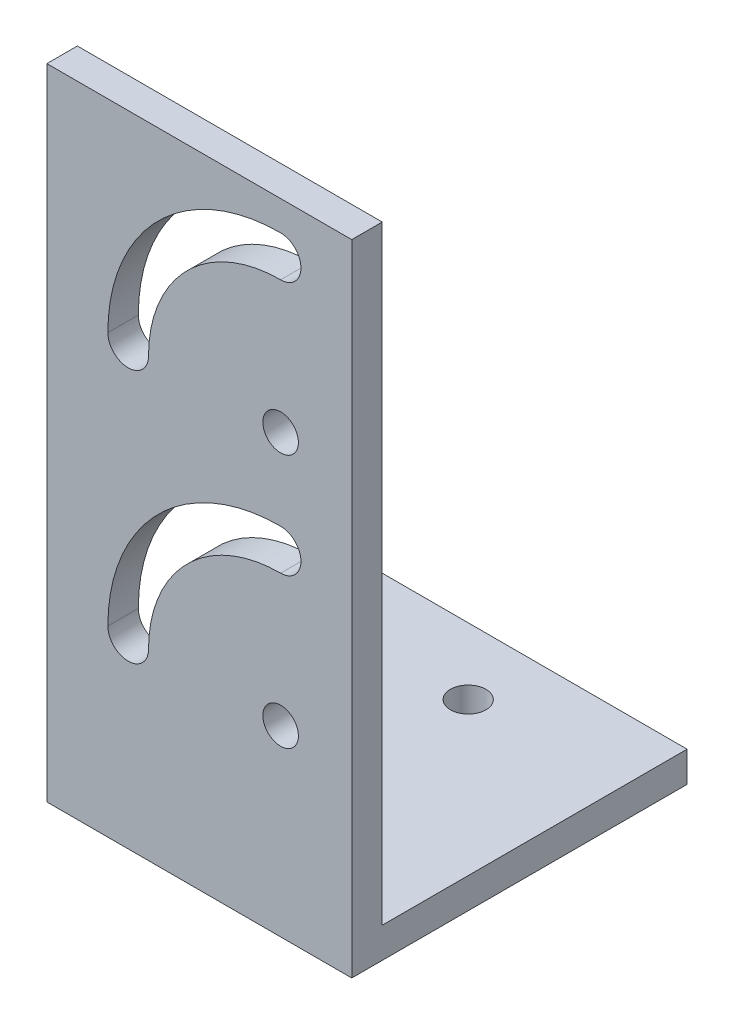
ISO-10303-21;
HEADER;
FILE_DESCRIPTION(('STEP AP214'),'2;1');
FILE_NAME('part.step','',(''),(''),'','','');
FILE_SCHEMA(('AUTOMOTIVE_DESIGN { 1 0 10303 214 1 1 1 1 }'));
ENDSEC;
DATA;
#1=APPLICATION_CONTEXT('core data for automotive mechanical design processes');
#2=APPLICATION_PROTOCOL_DEFINITION('international standard','automotive_design',2000,#1);
#3=PRODUCT_CONTEXT('',#1,'mechanical');
#4=PRODUCT('Part','Part','',(#3));
#5=PRODUCT_RELATED_PRODUCT_CATEGORY('part','',(#4));
#6=PRODUCT_DEFINITION_FORMATION('','',#4);
#7=PRODUCT_DEFINITION_CONTEXT('part definition',#1,'design');
#8=PRODUCT_DEFINITION('design','',#6,#7);
#9=PRODUCT_DEFINITION_SHAPE('','',#8);
#10=(LENGTH_UNIT() NAMED_UNIT(*) SI_UNIT(.MILLI.,.METRE.));
#11=(NAMED_UNIT(*) PLANE_ANGLE_UNIT() SI_UNIT($,.RADIAN.));
#12=(NAMED_UNIT(*) SI_UNIT($,.STERADIAN.) SOLID_ANGLE_UNIT());
#13=UNCERTAINTY_MEASURE_WITH_UNIT(LENGTH_MEASURE(1.E-05),#10,'distance_accuracy_value','');
#14=(GEOMETRIC_REPRESENTATION_CONTEXT(3) GLOBAL_UNCERTAINTY_ASSIGNED_CONTEXT((#13)) GLOBAL_UNIT_ASSIGNED_CONTEXT((#10,
#11,#12)) REPRESENTATION_CONTEXT('',''));
#15=CARTESIAN_POINT('',(0.,0.,0.));
#16=DIRECTION('',(0.,0.,1.));
#17=DIRECTION('',(1.,0.,0.));
#18=AXIS2_PLACEMENT_3D('',#15,#16,#17);
#19=CARTESIAN_POINT('',(15.,3.,15.));
#20=DIRECTION('',(-1.,0.,0.));
#21=DIRECTION('',(0.,0.,1.));
#22=AXIS2_PLACEMENT_3D('',#19,#20,#21);
#23=PLANE('',#22);
#24=DIRECTION('',(0.,0.,-1.));
#25=VECTOR('',#24,1.);
#26=CARTESIAN_POINT('',(15.,0.,15.));
#27=LINE('',#26,#25);
#28=CARTESIAN_POINT('',(15.,0.,18.));
#29=VERTEX_POINT('',#28);
#30=CARTESIAN_POINT('',(15.,0.,-15.));
#31=VERTEX_POINT('',#30);
#32=EDGE_CURVE('E244',#29,#31,#27,.T.);
#33=ORIENTED_EDGE('',*,*,#32,.T.);
#34=DIRECTION('',(0.,-1.,0.));
#35=VECTOR('',#34,1.);
#36=CARTESIAN_POINT('',(15.,3.,-15.));
#37=LINE('',#36,#35);
#38=CARTESIAN_POINT('',(15.,3.,-15.));
#39=VERTEX_POINT('',#38);
#40=EDGE_CURVE('E11',#39,#31,#37,.T.);
#41=ORIENTED_EDGE('',*,*,#40,.F.);
#42=DIRECTION('',(0.,0.,-1.));
#43=VECTOR('',#42,1.);
#44=CARTESIAN_POINT('',(15.,3.,15.));
#45=LINE('',#44,#43);
#46=CARTESIAN_POINT('',(15.,3.,15.));
#47=VERTEX_POINT('',#46);
#48=EDGE_CURVE('E253',#47,#39,#45,.T.);
#49=ORIENTED_EDGE('',*,*,#48,.F.);
#50=DIRECTION('',(0.,1.,0.));
#51=VECTOR('',#50,1.);
#52=CARTESIAN_POINT('',(15.,0.,15.));
#53=LINE('',#52,#51);
#54=CARTESIAN_POINT('',(15.,62.9241904633983,15.));
#55=VERTEX_POINT('',#54);
#56=EDGE_CURVE('E232',#47,#55,#53,.T.);
#57=ORIENTED_EDGE('',*,*,#56,.T.);
#58=DIRECTION('',(0.,0.,-1.));
#59=VECTOR('',#58,1.);
#60=CARTESIAN_POINT('',(15.,62.9241904633983,18.));
#61=LINE('',#60,#59);
#62=CARTESIAN_POINT('',(15.,62.9241904633983,18.));
#63=VERTEX_POINT('',#62);
#64=EDGE_CURVE('E237',#63,#55,#61,.T.);
#65=ORIENTED_EDGE('',*,*,#64,.F.);
#66=DIRECTION('',(0.,1.,0.));
#67=VECTOR('',#66,1.);
#68=CARTESIAN_POINT('',(15.,0.,18.));
#69=LINE('',#68,#67);
#70=EDGE_CURVE('E225',#29,#63,#69,.T.);
#71=ORIENTED_EDGE('',*,*,#70,.F.);
#72=EDGE_LOOP('',(#33,#41,#49,#57,#65,#71));
#73=FACE_BOUND('',#72,.T.);
#74=ADVANCED_FACE('F35',(#73),#23,.F.);
#75=CARTESIAN_POINT('',(-15.,3.,-15.));
#76=DIRECTION('',(0.,0.,1.));
#77=DIRECTION('',(1.,0.,0.));
#78=AXIS2_PLACEMENT_3D('',#75,#76,#77);
#79=PLANE('',#78);
#80=DIRECTION('',(-1.,0.,0.));
#81=VECTOR('',#80,1.);
#82=CARTESIAN_POINT('',(-15.,0.,-15.));
#83=LINE('',#82,#81);
#84=CARTESIAN_POINT('',(-15.,0.,-15.));
#85=VERTEX_POINT('',#84);
#86=EDGE_CURVE('E267',#31,#85,#83,.T.);
#87=ORIENTED_EDGE('',*,*,#86,.T.);
#88=DIRECTION('',(0.,-1.,0.));
#89=VECTOR('',#88,1.);
#90=CARTESIAN_POINT('',(-15.,3.,-15.));
#91=LINE('',#90,#89);
#92=CARTESIAN_POINT('',(-15.,3.,-15.));
#93=VERTEX_POINT('',#92);
#94=EDGE_CURVE('E42',#93,#85,#91,.T.);
#95=ORIENTED_EDGE('',*,*,#94,.F.);
#96=DIRECTION('',(-1.,0.,0.));
#97=VECTOR('',#96,1.);
#98=CARTESIAN_POINT('',(-15.,3.,-15.));
#99=LINE('',#98,#97);
#100=EDGE_CURVE('E256',#39,#93,#99,.T.);
#101=ORIENTED_EDGE('',*,*,#100,.F.);
#102=ORIENTED_EDGE('',*,*,#40,.T.);
#103=EDGE_LOOP('',(#87,#95,#101,#102));
#104=FACE_BOUND('',#103,.T.);
#105=ADVANCED_FACE('F295',(#104),#79,.F.);
#106=CARTESIAN_POINT('',(-15.,3.,15.));
#107=DIRECTION('',(1.,0.,0.));
#108=DIRECTION('',(0.,0.,-1.));
#109=AXIS2_PLACEMENT_3D('',#106,#107,#108);
#110=PLANE('',#109);
#111=DIRECTION('',(0.,0.,1.));
#112=VECTOR('',#111,1.);
#113=CARTESIAN_POINT('',(-15.,0.,15.));
#114=LINE('',#113,#112);
#115=CARTESIAN_POINT('',(-15.,0.,18.));
#116=VERTEX_POINT('',#115);
#117=EDGE_CURVE('E257',#85,#116,#114,.T.);
#118=ORIENTED_EDGE('',*,*,#117,.T.);
#119=DIRECTION('',(0.,-1.,0.));
#120=VECTOR('',#119,1.);
#121=CARTESIAN_POINT('',(-15.,0.,18.));
#122=LINE('',#121,#120);
#123=CARTESIAN_POINT('',(-15.,62.9241904633983,18.));
#124=VERTEX_POINT('',#123);
#125=EDGE_CURVE('E218',#124,#116,#122,.T.);
#126=ORIENTED_EDGE('',*,*,#125,.F.);
#127=DIRECTION('',(0.,0.,-1.));
#128=VECTOR('',#127,1.);
#129=CARTESIAN_POINT('',(-15.,62.9241904633983,18.));
#130=LINE('',#129,#128);
#131=CARTESIAN_POINT('',(-15.,62.9241904633983,15.));
#132=VERTEX_POINT('',#131);
#133=EDGE_CURVE('E229',#124,#132,#130,.T.);
#134=ORIENTED_EDGE('',*,*,#133,.T.);
#135=DIRECTION('',(0.,-1.,0.));
#136=VECTOR('',#135,1.);
#137=CARTESIAN_POINT('',(-15.,0.,15.));
#138=LINE('',#137,#136);
#139=CARTESIAN_POINT('',(-15.,3.,15.));
#140=VERTEX_POINT('',#139);
#141=EDGE_CURVE('E215',#132,#140,#138,.T.);
#142=ORIENTED_EDGE('',*,*,#141,.T.);
#143=DIRECTION('',(0.,0.,1.));
#144=VECTOR('',#143,1.);
#145=CARTESIAN_POINT('',(-15.,3.,15.));
#146=LINE('',#145,#144);
#147=EDGE_CURVE('E259',#93,#140,#146,.T.);
#148=ORIENTED_EDGE('',*,*,#147,.F.);
#149=ORIENTED_EDGE('',*,*,#94,.T.);
#150=EDGE_LOOP('',(#118,#126,#134,#142,#148,#149));
#151=FACE_BOUND('',#150,.T.);
#152=ADVANCED_FACE('F274',(#151),#110,.F.);
#153=CARTESIAN_POINT('',(0.,3.,0.));
#154=DIRECTION('',(0.,-1.,0.));
#155=DIRECTION('',(0.,0.,-1.));
#156=AXIS2_PLACEMENT_3D('',#153,#154,#155);
#157=PLANE('',#156);
#158=CARTESIAN_POINT('',(0.,3.,6.54268355275151));
#159=DIRECTION('',(0.,1.,0.));
#160=DIRECTION('',(0.,0.,1.));
#161=AXIS2_PLACEMENT_3D('',#158,#159,#160);
#162=CIRCLE('',#161,1.75);
#163=CARTESIAN_POINT('',(0.,3.,8.29268355275151));
#164=VERTEX_POINT('',#163);
#165=EDGE_CURVE('E245',#164,#164,#162,.T.);
#166=ORIENTED_EDGE('',*,*,#165,.F.);
#167=EDGE_LOOP('',(#166));
#168=FACE_BOUND('',#167,.T.);
#169=CARTESIAN_POINT('',(0.,3.,-8.45731644724849));
#170=DIRECTION('',(0.,1.,0.));
#171=DIRECTION('',(0.,0.,1.));
#172=AXIS2_PLACEMENT_3D('',#169,#170,#171);
#173=CIRCLE('',#172,1.75);
#174=CARTESIAN_POINT('',(0.,3.,-6.70731644724849));
#175=VERTEX_POINT('',#174);
#176=EDGE_CURVE('E240',#175,#175,#173,.T.);
#177=ORIENTED_EDGE('',*,*,#176,.F.);
#178=EDGE_LOOP('',(#177));
#179=FACE_BOUND('',#178,.T.);
#180=ORIENTED_EDGE('',*,*,#48,.T.);
#181=ORIENTED_EDGE('',*,*,#100,.T.);
#182=ORIENTED_EDGE('',*,*,#147,.T.);
#183=DIRECTION('',(1.,0.,0.));
#184=VECTOR('',#183,1.);
#185=CARTESIAN_POINT('',(-15.,3.,15.));
#186=LINE('',#185,#184);
#187=EDGE_CURVE('E262',#140,#47,#186,.T.);
#188=ORIENTED_EDGE('',*,*,#187,.T.);
#189=EDGE_LOOP('',(#180,#181,#182,#188));
#190=FACE_BOUND('',#189,.T.);
#191=ADVANCED_FACE('F291',(#168,#179,#190),#157,.F.);
#192=CARTESIAN_POINT('',(0.,0.,0.));
#193=DIRECTION('',(0.,-1.,0.));
#194=DIRECTION('',(0.,0.,-1.));
#195=AXIS2_PLACEMENT_3D('',#192,#193,#194);
#196=PLANE('',#195);
#197=CARTESIAN_POINT('',(0.,0.,6.54268355275151));
#198=DIRECTION('',(0.,1.,0.));
#199=DIRECTION('',(0.,0.,1.));
#200=AXIS2_PLACEMENT_3D('',#197,#198,#199);
#201=CIRCLE('',#200,1.75);
#202=CARTESIAN_POINT('',(0.,0.,8.29268355275151));
#203=VERTEX_POINT('',#202);
#204=EDGE_CURVE('E241',#203,#203,#201,.T.);
#205=ORIENTED_EDGE('',*,*,#204,.T.);
#206=EDGE_LOOP('',(#205));
#207=FACE_BOUND('',#206,.T.);
#208=CARTESIAN_POINT('',(0.,0.,-8.45731644724849));
#209=DIRECTION('',(0.,1.,0.));
#210=DIRECTION('',(0.,0.,1.));
#211=AXIS2_PLACEMENT_3D('',#208,#209,#210);
#212=CIRCLE('',#211,1.75);
#213=CARTESIAN_POINT('',(0.,0.,-6.70731644724849));
#214=VERTEX_POINT('',#213);
#215=EDGE_CURVE('E248',#214,#214,#212,.T.);
#216=ORIENTED_EDGE('',*,*,#215,.T.);
#217=EDGE_LOOP('',(#216));
#218=FACE_BOUND('',#217,.T.);
#219=ORIENTED_EDGE('',*,*,#32,.F.);
#220=DIRECTION('',(1.,0.,0.));
#221=VECTOR('',#220,1.);
#222=CARTESIAN_POINT('',(-15.,0.,18.));
#223=LINE('',#222,#221);
#224=EDGE_CURVE('E221',#116,#29,#223,.T.);
#225=ORIENTED_EDGE('',*,*,#224,.F.);
#226=ORIENTED_EDGE('',*,*,#117,.F.);
#227=ORIENTED_EDGE('',*,*,#86,.F.);
#228=EDGE_LOOP('',(#219,#225,#226,#227));
#229=FACE_BOUND('',#228,.T.);
#230=ADVANCED_FACE('F279',(#207,#218,#229),#196,.T.);
#231=CARTESIAN_POINT('',(0.,0.,-8.45731644724849));
#232=DIRECTION('',(0.,1.,0.));
#233=DIRECTION('',(0.,0.,1.));
#234=AXIS2_PLACEMENT_3D('',#231,#232,#233);
#235=CYLINDRICAL_SURFACE('',#234,1.75);
#236=ORIENTED_EDGE('',*,*,#215,.F.);
#237=EDGE_LOOP('',(#236));
#238=FACE_BOUND('',#237,.T.);
#239=ORIENTED_EDGE('',*,*,#176,.T.);
#240=EDGE_LOOP('',(#239));
#241=FACE_BOUND('',#240,.T.);
#242=ADVANCED_FACE('F305',(#238,#241),#235,.F.);
#243=CARTESIAN_POINT('',(0.,0.,6.54268355275151));
#244=DIRECTION('',(0.,1.,0.));
#245=DIRECTION('',(0.,0.,1.));
#246=AXIS2_PLACEMENT_3D('',#243,#244,#245);
#247=CYLINDRICAL_SURFACE('',#246,1.75);
#248=ORIENTED_EDGE('',*,*,#204,.F.);
#249=EDGE_LOOP('',(#248));
#250=FACE_BOUND('',#249,.T.);
#251=ORIENTED_EDGE('',*,*,#165,.T.);
#252=EDGE_LOOP('',(#251));
#253=FACE_BOUND('',#252,.T.);
#254=ADVANCED_FACE('F312',(#250,#253),#247,.F.);
#255=CARTESIAN_POINT('',(0.,0.,15.));
#256=DIRECTION('',(0.,0.,-1.));
#257=DIRECTION('',(-1.,0.,0.));
#258=AXIS2_PLACEMENT_3D('',#255,#256,#257);
#259=PLANE('',#258);
#260=CARTESIAN_POINT('',(8.,43.,15.));
#261=DIRECTION('',(0.,0.,1.));
#262=DIRECTION('',(-1.,0.,0.));
#263=AXIS2_PLACEMENT_3D('',#260,#261,#262);
#264=CIRCLE('',#263,17.);
#265=CARTESIAN_POINT('',(8.00000000000001,60.,15.));
#266=VERTEX_POINT('',#265);
#267=CARTESIAN_POINT('',(-8.99999999999999,43.,15.));
#268=VERTEX_POINT('',#267);
#269=EDGE_CURVE('E176',#266,#268,#264,.T.);
#270=ORIENTED_EDGE('',*,*,#269,.T.);
#271=CARTESIAN_POINT('',(-6.99999999999999,43.,15.));
#272=DIRECTION('',(0.,0.,1.));
#273=DIRECTION('',(-1.,0.,0.));
#274=AXIS2_PLACEMENT_3D('',#271,#272,#273);
#275=CIRCLE('',#274,2.);
#276=CARTESIAN_POINT('',(-4.99999999999999,43.,15.));
#277=VERTEX_POINT('',#276);
#278=EDGE_CURVE('E179',#268,#277,#275,.T.);
#279=ORIENTED_EDGE('',*,*,#278,.T.);
#280=CARTESIAN_POINT('',(8.,43.,15.));
#281=DIRECTION('',(0.,0.,-1.));
#282=DIRECTION('',(-1.,0.,0.));
#283=AXIS2_PLACEMENT_3D('',#280,#281,#282);
#284=CIRCLE('',#283,13.);
#285=CARTESIAN_POINT('',(8.00000000000001,56.,15.));
#286=VERTEX_POINT('',#285);
#287=EDGE_CURVE('E49',#277,#286,#284,.T.);
#288=ORIENTED_EDGE('',*,*,#287,.T.);
#289=CARTESIAN_POINT('',(8.00000000000001,58.,15.));
#290=DIRECTION('',(0.,0.,1.));
#291=DIRECTION('',(-1.,0.,0.));
#292=AXIS2_PLACEMENT_3D('',#289,#290,#291);
#293=CIRCLE('',#292,2.);
#294=EDGE_CURVE('E184',#286,#266,#293,.T.);
#295=ORIENTED_EDGE('',*,*,#294,.T.);
#296=EDGE_LOOP('',(#270,#279,#288,#295));
#297=FACE_BOUND('',#296,.T.);
#298=CARTESIAN_POINT('',(8.,18.,15.));
#299=DIRECTION('',(0.,0.,1.));
#300=DIRECTION('',(-1.,0.,0.));
#301=AXIS2_PLACEMENT_3D('',#298,#299,#300);
#302=CIRCLE('',#301,1.75);
#303=CARTESIAN_POINT('',(6.25,18.,15.));
#304=VERTEX_POINT('',#303);
#305=EDGE_CURVE('E191',#304,#304,#302,.T.);
#306=ORIENTED_EDGE('',*,*,#305,.T.);
#307=EDGE_LOOP('',(#306));
#308=FACE_BOUND('',#307,.T.);
#309=CARTESIAN_POINT('',(8.,18.,15.));
#310=DIRECTION('',(0.,0.,-1.));
#311=DIRECTION('',(-1.,0.,0.));
#312=AXIS2_PLACEMENT_3D('',#309,#310,#311);
#313=CIRCLE('',#312,13.);
#314=CARTESIAN_POINT('',(-5.,18.,15.));
#315=VERTEX_POINT('',#314);
#316=CARTESIAN_POINT('',(8.,31.,15.));
#317=VERTEX_POINT('',#316);
#318=EDGE_CURVE('E139',#315,#317,#313,.T.);
#319=ORIENTED_EDGE('',*,*,#318,.T.);
#320=CARTESIAN_POINT('',(8.,33.,15.));
#321=DIRECTION('',(0.,0.,1.));
#322=DIRECTION('',(-1.,0.,0.));
#323=AXIS2_PLACEMENT_3D('',#320,#321,#322);
#324=CIRCLE('',#323,2.);
#325=CARTESIAN_POINT('',(8.,35.,15.));
#326=VERTEX_POINT('',#325);
#327=EDGE_CURVE('E150',#317,#326,#324,.T.);
#328=ORIENTED_EDGE('',*,*,#327,.T.);
#329=CARTESIAN_POINT('',(8.,18.,15.));
#330=DIRECTION('',(0.,0.,1.));
#331=DIRECTION('',(-1.,0.,0.));
#332=AXIS2_PLACEMENT_3D('',#329,#330,#331);
#333=CIRCLE('',#332,17.);
#334=CARTESIAN_POINT('',(-9.,18.,15.));
#335=VERTEX_POINT('',#334);
#336=EDGE_CURVE('E57',#326,#335,#333,.T.);
#337=ORIENTED_EDGE('',*,*,#336,.T.);
#338=CARTESIAN_POINT('',(-7.,18.,15.));
#339=DIRECTION('',(0.,0.,1.));
#340=DIRECTION('',(-1.,0.,0.));
#341=AXIS2_PLACEMENT_3D('',#338,#339,#340);
#342=CIRCLE('',#341,2.);
#343=EDGE_CURVE('E147',#335,#315,#342,.T.);
#344=ORIENTED_EDGE('',*,*,#343,.T.);
#345=EDGE_LOOP('',(#319,#328,#337,#344));
#346=FACE_BOUND('',#345,.T.);
#347=CARTESIAN_POINT('',(8.,43.,15.));
#348=DIRECTION('',(0.,0.,1.));
#349=DIRECTION('',(-1.,0.,0.));
#350=AXIS2_PLACEMENT_3D('',#347,#348,#349);
#351=CIRCLE('',#350,1.75);
#352=CARTESIAN_POINT('',(6.25,43.,15.));
#353=VERTEX_POINT('',#352);
#354=EDGE_CURVE('E212',#353,#353,#351,.T.);
#355=ORIENTED_EDGE('',*,*,#354,.T.);
#356=EDGE_LOOP('',(#355));
#357=FACE_BOUND('',#356,.T.);
#358=ORIENTED_EDGE('',*,*,#187,.F.);
#359=ORIENTED_EDGE('',*,*,#141,.F.);
#360=DIRECTION('',(-1.,0.,0.));
#361=VECTOR('',#360,1.);
#362=CARTESIAN_POINT('',(-15.,62.9241904633983,15.));
#363=LINE('',#362,#361);
#364=EDGE_CURVE('E222',#55,#132,#363,.T.);
#365=ORIENTED_EDGE('',*,*,#364,.F.);
#366=ORIENTED_EDGE('',*,*,#56,.F.);
#367=EDGE_LOOP('',(#358,#359,#365,#366));
#368=FACE_BOUND('',#367,.T.);
#369=ADVANCED_FACE('F154',(#297,#308,#346,#357,#368),#259,.T.);
#370=CARTESIAN_POINT('',(-15.,62.9241904633983,18.));
#371=DIRECTION('',(0.,-1.,0.));
#372=DIRECTION('',(0.,0.,-1.));
#373=AXIS2_PLACEMENT_3D('',#370,#371,#372);
#374=PLANE('',#373);
#375=ORIENTED_EDGE('',*,*,#364,.T.);
#376=ORIENTED_EDGE('',*,*,#133,.F.);
#377=DIRECTION('',(-1.,0.,0.));
#378=VECTOR('',#377,1.);
#379=CARTESIAN_POINT('',(-15.,62.9241904633983,18.));
#380=LINE('',#379,#378);
#381=EDGE_CURVE('E227',#63,#124,#380,.T.);
#382=ORIENTED_EDGE('',*,*,#381,.F.);
#383=ORIENTED_EDGE('',*,*,#64,.T.);
#384=EDGE_LOOP('',(#375,#376,#382,#383));
#385=FACE_BOUND('',#384,.T.);
#386=ADVANCED_FACE('F317',(#385),#374,.F.);
#387=CARTESIAN_POINT('',(0.,0.,18.));
#388=DIRECTION('',(0.,0.,-1.));
#389=DIRECTION('',(-1.,0.,0.));
#390=AXIS2_PLACEMENT_3D('',#387,#388,#389);
#391=PLANE('',#390);
#392=CARTESIAN_POINT('',(-6.99999999999999,43.,18.));
#393=DIRECTION('',(0.,0.,1.));
#394=DIRECTION('',(-1.,0.,0.));
#395=AXIS2_PLACEMENT_3D('',#392,#393,#394);
#396=CIRCLE('',#395,2.);
#397=CARTESIAN_POINT('',(-8.99999999999999,43.,18.));
#398=VERTEX_POINT('',#397);
#399=CARTESIAN_POINT('',(-4.99999999999999,43.,18.));
#400=VERTEX_POINT('',#399);
#401=EDGE_CURVE('E190',#398,#400,#396,.T.);
#402=ORIENTED_EDGE('',*,*,#401,.F.);
#403=CARTESIAN_POINT('',(8.,43.,18.));
#404=DIRECTION('',(0.,0.,1.));
#405=DIRECTION('',(-1.,0.,0.));
#406=AXIS2_PLACEMENT_3D('',#403,#404,#405);
#407=CIRCLE('',#406,17.);
#408=CARTESIAN_POINT('',(8.00000000000001,60.,18.));
#409=VERTEX_POINT('',#408);
#410=EDGE_CURVE('E188',#409,#398,#407,.T.);
#411=ORIENTED_EDGE('',*,*,#410,.F.);
#412=CARTESIAN_POINT('',(8.00000000000001,58.,18.));
#413=DIRECTION('',(0.,0.,1.));
#414=DIRECTION('',(-1.,0.,0.));
#415=AXIS2_PLACEMENT_3D('',#412,#413,#414);
#416=CIRCLE('',#415,2.);
#417=CARTESIAN_POINT('',(8.00000000000001,56.,18.));
#418=VERTEX_POINT('',#417);
#419=EDGE_CURVE('E180',#418,#409,#416,.T.);
#420=ORIENTED_EDGE('',*,*,#419,.F.);
#421=CARTESIAN_POINT('',(8.,43.,18.));
#422=DIRECTION('',(0.,0.,-1.));
#423=DIRECTION('',(-1.,0.,0.));
#424=AXIS2_PLACEMENT_3D('',#421,#422,#423);
#425=CIRCLE('',#424,13.);
#426=EDGE_CURVE('E194',#400,#418,#425,.T.);
#427=ORIENTED_EDGE('',*,*,#426,.F.);
#428=EDGE_LOOP('',(#402,#411,#420,#427));
#429=FACE_BOUND('',#428,.T.);
#430=CARTESIAN_POINT('',(8.,18.,18.));
#431=DIRECTION('',(0.,0.,1.));
#432=DIRECTION('',(-1.,0.,0.));
#433=AXIS2_PLACEMENT_3D('',#430,#431,#432);
#434=CIRCLE('',#433,1.75);
#435=CARTESIAN_POINT('',(6.25,18.,18.));
#436=VERTEX_POINT('',#435);
#437=EDGE_CURVE('E172',#436,#436,#434,.T.);
#438=ORIENTED_EDGE('',*,*,#437,.F.);
#439=EDGE_LOOP('',(#438));
#440=FACE_BOUND('',#439,.T.);
#441=CARTESIAN_POINT('',(8.,33.,18.));
#442=DIRECTION('',(0.,0.,1.));
#443=DIRECTION('',(-1.,0.,0.));
#444=AXIS2_PLACEMENT_3D('',#441,#442,#443);
#445=CIRCLE('',#444,2.);
#446=CARTESIAN_POINT('',(8.,31.,18.));
#447=VERTEX_POINT('',#446);
#448=CARTESIAN_POINT('',(8.,35.,18.));
#449=VERTEX_POINT('',#448);
#450=EDGE_CURVE('E166',#447,#449,#445,.T.);
#451=ORIENTED_EDGE('',*,*,#450,.F.);
#452=CARTESIAN_POINT('',(8.,18.,18.));
#453=DIRECTION('',(0.,0.,-1.));
#454=DIRECTION('',(-1.,0.,0.));
#455=AXIS2_PLACEMENT_3D('',#452,#453,#454);
#456=CIRCLE('',#455,13.);
#457=CARTESIAN_POINT('',(-5.,18.,18.));
#458=VERTEX_POINT('',#457);
#459=EDGE_CURVE('E142',#458,#447,#456,.T.);
#460=ORIENTED_EDGE('',*,*,#459,.F.);
#461=CARTESIAN_POINT('',(-7.,18.,18.));
#462=DIRECTION('',(0.,0.,1.));
#463=DIRECTION('',(-1.,0.,0.));
#464=AXIS2_PLACEMENT_3D('',#461,#462,#463);
#465=CIRCLE('',#464,2.);
#466=CARTESIAN_POINT('',(-9.,18.,18.));
#467=VERTEX_POINT('',#466);
#468=EDGE_CURVE('E157',#467,#458,#465,.T.);
#469=ORIENTED_EDGE('',*,*,#468,.F.);
#470=CARTESIAN_POINT('',(8.,18.,18.));
#471=DIRECTION('',(0.,0.,1.));
#472=DIRECTION('',(-1.,0.,0.));
#473=AXIS2_PLACEMENT_3D('',#470,#471,#472);
#474=CIRCLE('',#473,17.);
#475=EDGE_CURVE('E160',#449,#467,#474,.T.);
#476=ORIENTED_EDGE('',*,*,#475,.F.);
#477=EDGE_LOOP('',(#451,#460,#469,#476));
#478=FACE_BOUND('',#477,.T.);
#479=CARTESIAN_POINT('',(8.,43.,18.));
#480=DIRECTION('',(0.,0.,1.));
#481=DIRECTION('',(-1.,0.,0.));
#482=AXIS2_PLACEMENT_3D('',#479,#480,#481);
#483=CIRCLE('',#482,1.75);
#484=CARTESIAN_POINT('',(6.25,43.,18.));
#485=VERTEX_POINT('',#484);
#486=EDGE_CURVE('E201',#485,#485,#483,.T.);
#487=ORIENTED_EDGE('',*,*,#486,.F.);
#488=EDGE_LOOP('',(#487));
#489=FACE_BOUND('',#488,.T.);
#490=ORIENTED_EDGE('',*,*,#125,.T.);
#491=ORIENTED_EDGE('',*,*,#224,.T.);
#492=ORIENTED_EDGE('',*,*,#70,.T.);
#493=ORIENTED_EDGE('',*,*,#381,.T.);
#494=EDGE_LOOP('',(#490,#491,#492,#493));
#495=FACE_BOUND('',#494,.T.);
#496=ADVANCED_FACE('F282',(#429,#440,#478,#489,#495),#391,.F.);
#497=CARTESIAN_POINT('',(8.,43.,15.));
#498=DIRECTION('',(0.,0.,1.));
#499=DIRECTION('',(1.,0.,0.));
#500=AXIS2_PLACEMENT_3D('',#497,#498,#499);
#501=CYLINDRICAL_SURFACE('',#500,1.75);
#502=ORIENTED_EDGE('',*,*,#354,.F.);
#503=EDGE_LOOP('',(#502));
#504=FACE_BOUND('',#503,.T.);
#505=ORIENTED_EDGE('',*,*,#486,.T.);
#506=EDGE_LOOP('',(#505));
#507=FACE_BOUND('',#506,.T.);
#508=ADVANCED_FACE('F325',(#504,#507),#501,.F.);
#509=CARTESIAN_POINT('',(8.,18.,15.));
#510=DIRECTION('',(0.,0.,1.));
#511=DIRECTION('',(1.,0.,0.));
#512=AXIS2_PLACEMENT_3D('',#509,#510,#511);
#513=CYLINDRICAL_SURFACE('',#512,13.);
#514=ORIENTED_EDGE('',*,*,#459,.T.);
#515=DIRECTION('',(0.,0.,1.));
#516=VECTOR('',#515,1.);
#517=CARTESIAN_POINT('',(8.,31.,15.));
#518=LINE('',#517,#516);
#519=EDGE_CURVE('E135',#317,#447,#518,.T.);
#520=ORIENTED_EDGE('',*,*,#519,.F.);
#521=ORIENTED_EDGE('',*,*,#318,.F.);
#522=DIRECTION('',(0.,0.,1.));
#523=VECTOR('',#522,1.);
#524=CARTESIAN_POINT('',(-5.,18.,15.));
#525=LINE('',#524,#523);
#526=EDGE_CURVE('E170',#315,#458,#525,.T.);
#527=ORIENTED_EDGE('',*,*,#526,.T.);
#528=EDGE_LOOP('',(#514,#520,#521,#527));
#529=FACE_BOUND('',#528,.T.);
#530=ADVANCED_FACE('F137',(#529),#513,.T.);
#531=CARTESIAN_POINT('',(-7.,18.,15.));
#532=DIRECTION('',(0.,0.,1.));
#533=DIRECTION('',(1.,0.,0.));
#534=AXIS2_PLACEMENT_3D('',#531,#532,#533);
#535=CYLINDRICAL_SURFACE('',#534,2.);
#536=ORIENTED_EDGE('',*,*,#468,.T.);
#537=ORIENTED_EDGE('',*,*,#526,.F.);
#538=ORIENTED_EDGE('',*,*,#343,.F.);
#539=DIRECTION('',(0.,0.,1.));
#540=VECTOR('',#539,1.);
#541=CARTESIAN_POINT('',(-9.,18.,15.));
#542=LINE('',#541,#540);
#543=EDGE_CURVE('E173',#335,#467,#542,.T.);
#544=ORIENTED_EDGE('',*,*,#543,.T.);
#545=EDGE_LOOP('',(#536,#537,#538,#544));
#546=FACE_BOUND('',#545,.T.);
#547=ADVANCED_FACE('F351',(#546),#535,.F.);
#548=CARTESIAN_POINT('',(8.,18.,15.));
#549=DIRECTION('',(0.,0.,1.));
#550=DIRECTION('',(1.,0.,0.));
#551=AXIS2_PLACEMENT_3D('',#548,#549,#550);
#552=CYLINDRICAL_SURFACE('',#551,17.);
#553=ORIENTED_EDGE('',*,*,#475,.T.);
#554=ORIENTED_EDGE('',*,*,#543,.F.);
#555=ORIENTED_EDGE('',*,*,#336,.F.);
#556=DIRECTION('',(0.,0.,1.));
#557=VECTOR('',#556,1.);
#558=CARTESIAN_POINT('',(8.,35.,15.));
#559=LINE('',#558,#557);
#560=EDGE_CURVE('E146',#326,#449,#559,.T.);
#561=ORIENTED_EDGE('',*,*,#560,.T.);
#562=EDGE_LOOP('',(#553,#554,#555,#561));
#563=FACE_BOUND('',#562,.T.);
#564=ADVANCED_FACE('F354',(#563),#552,.F.);
#565=CARTESIAN_POINT('',(8.,33.,15.));
#566=DIRECTION('',(0.,0.,1.));
#567=DIRECTION('',(1.,0.,0.));
#568=AXIS2_PLACEMENT_3D('',#565,#566,#567);
#569=CYLINDRICAL_SURFACE('',#568,2.);
#570=ORIENTED_EDGE('',*,*,#450,.T.);
#571=ORIENTED_EDGE('',*,*,#560,.F.);
#572=ORIENTED_EDGE('',*,*,#327,.F.);
#573=ORIENTED_EDGE('',*,*,#519,.T.);
#574=EDGE_LOOP('',(#570,#571,#572,#573));
#575=FACE_BOUND('',#574,.T.);
#576=ADVANCED_FACE('F151',(#575),#569,.F.);
#577=CARTESIAN_POINT('',(8.,18.,15.));
#578=DIRECTION('',(0.,0.,1.));
#579=DIRECTION('',(1.,0.,0.));
#580=AXIS2_PLACEMENT_3D('',#577,#578,#579);
#581=CYLINDRICAL_SURFACE('',#580,1.75);
#582=ORIENTED_EDGE('',*,*,#305,.F.);
#583=EDGE_LOOP('',(#582));
#584=FACE_BOUND('',#583,.T.);
#585=ORIENTED_EDGE('',*,*,#437,.T.);
#586=EDGE_LOOP('',(#585));
#587=FACE_BOUND('',#586,.T.);
#588=ADVANCED_FACE('F330',(#584,#587),#581,.F.);
#589=CARTESIAN_POINT('',(8.,43.,15.));
#590=DIRECTION('',(0.,0.,1.));
#591=DIRECTION('',(1.,0.,0.));
#592=AXIS2_PLACEMENT_3D('',#589,#590,#591);
#593=CYLINDRICAL_SURFACE('',#592,17.);
#594=ORIENTED_EDGE('',*,*,#410,.T.);
#595=DIRECTION('',(0.,0.,1.));
#596=VECTOR('',#595,1.);
#597=CARTESIAN_POINT('',(-8.99999999999999,43.,15.));
#598=LINE('',#597,#596);
#599=EDGE_CURVE('E187',#268,#398,#598,.T.);
#600=ORIENTED_EDGE('',*,*,#599,.F.);
#601=ORIENTED_EDGE('',*,*,#269,.F.);
#602=DIRECTION('',(0.,0.,1.));
#603=VECTOR('',#602,1.);
#604=CARTESIAN_POINT('',(8.00000000000001,60.,15.));
#605=LINE('',#604,#603);
#606=EDGE_CURVE('E199',#266,#409,#605,.T.);
#607=ORIENTED_EDGE('',*,*,#606,.T.);
#608=EDGE_LOOP('',(#594,#600,#601,#607));
#609=FACE_BOUND('',#608,.T.);
#610=ADVANCED_FACE('F333',(#609),#593,.F.);
#611=CARTESIAN_POINT('',(8.00000000000001,58.,15.));
#612=DIRECTION('',(0.,0.,1.));
#613=DIRECTION('',(1.,0.,0.));
#614=AXIS2_PLACEMENT_3D('',#611,#612,#613);
#615=CYLINDRICAL_SURFACE('',#614,2.);
#616=ORIENTED_EDGE('',*,*,#419,.T.);
#617=ORIENTED_EDGE('',*,*,#606,.F.);
#618=ORIENTED_EDGE('',*,*,#294,.F.);
#619=DIRECTION('',(0.,0.,1.));
#620=VECTOR('',#619,1.);
#621=CARTESIAN_POINT('',(8.00000000000001,56.,15.));
#622=LINE('',#621,#620);
#623=EDGE_CURVE('E202',#286,#418,#622,.T.);
#624=ORIENTED_EDGE('',*,*,#623,.T.);
#625=EDGE_LOOP('',(#616,#617,#618,#624));
#626=FACE_BOUND('',#625,.T.);
#627=ADVANCED_FACE('F337',(#626),#615,.F.);
#628=CARTESIAN_POINT('',(8.,43.,15.));
#629=DIRECTION('',(0.,0.,1.));
#630=DIRECTION('',(1.,0.,0.));
#631=AXIS2_PLACEMENT_3D('',#628,#629,#630);
#632=CYLINDRICAL_SURFACE('',#631,13.);
#633=ORIENTED_EDGE('',*,*,#426,.T.);
#634=ORIENTED_EDGE('',*,*,#623,.F.);
#635=ORIENTED_EDGE('',*,*,#287,.F.);
#636=DIRECTION('',(0.,0.,1.));
#637=VECTOR('',#636,1.);
#638=CARTESIAN_POINT('',(-4.99999999999999,43.,15.));
#639=LINE('',#638,#637);
#640=EDGE_CURVE('E204',#277,#400,#639,.T.);
#641=ORIENTED_EDGE('',*,*,#640,.T.);
#642=EDGE_LOOP('',(#633,#634,#635,#641));
#643=FACE_BOUND('',#642,.T.);
#644=ADVANCED_FACE('F342',(#643),#632,.T.);
#645=CARTESIAN_POINT('',(-6.99999999999999,43.,15.));
#646=DIRECTION('',(0.,0.,1.));
#647=DIRECTION('',(1.,0.,0.));
#648=AXIS2_PLACEMENT_3D('',#645,#646,#647);
#649=CYLINDRICAL_SURFACE('',#648,2.);
#650=ORIENTED_EDGE('',*,*,#401,.T.);
#651=ORIENTED_EDGE('',*,*,#640,.F.);
#652=ORIENTED_EDGE('',*,*,#278,.F.);
#653=ORIENTED_EDGE('',*,*,#599,.T.);
#654=EDGE_LOOP('',(#650,#651,#652,#653));
#655=FACE_BOUND('',#654,.T.);
#656=ADVANCED_FACE('F339',(#655),#649,.F.);
#657=CLOSED_SHELL('',(#74,#105,#152,#191,#230,#242,#254,#369,#386,#496,#508,#530,#547,#564,#576,
#588,#610,#627,#644,#656));
#658=MANIFOLD_SOLID_BREP('B2',#657);
#659=ADVANCED_BREP_SHAPE_REPRESENTATION('',(#18,#658),#14);
#660=SHAPE_DEFINITION_REPRESENTATION(#9,#659);
ENDSEC;
END-ISO-10303-21;
